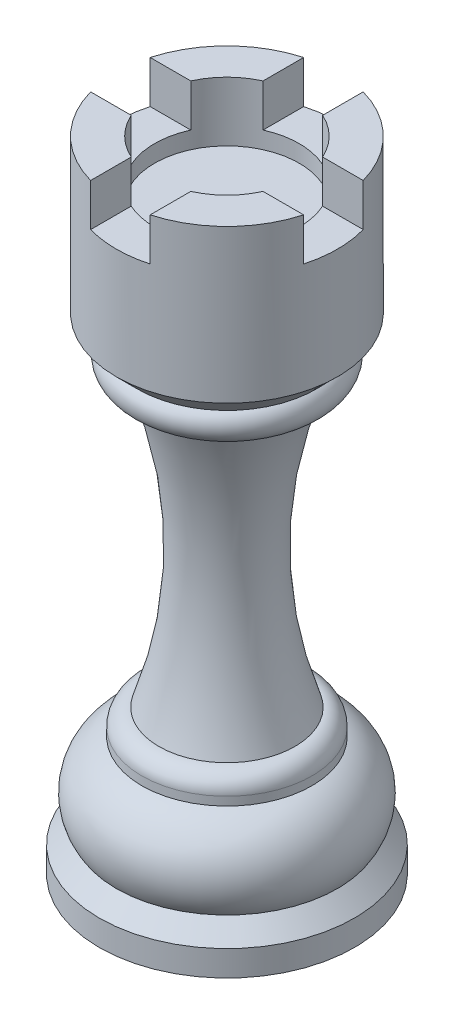
ISO-10303-21;
HEADER;
FILE_DESCRIPTION(('STEP AP214'),'2;1');
FILE_NAME('part.step','',(''),(''),'','','');
FILE_SCHEMA(('AUTOMOTIVE_DESIGN { 1 0 10303 214 1 1 1 1 }'));
ENDSEC;
DATA;
#1=APPLICATION_CONTEXT('core data for automotive mechanical design processes');
#2=APPLICATION_PROTOCOL_DEFINITION('international standard','automotive_design',2000,#1);
#3=PRODUCT_CONTEXT('',#1,'mechanical');
#4=PRODUCT('Part','Part','',(#3));
#5=PRODUCT_RELATED_PRODUCT_CATEGORY('part','',(#4));
#6=PRODUCT_DEFINITION_FORMATION('','',#4);
#7=PRODUCT_DEFINITION_CONTEXT('part definition',#1,'design');
#8=PRODUCT_DEFINITION('design','',#6,#7);
#9=PRODUCT_DEFINITION_SHAPE('','',#8);
#10=(LENGTH_UNIT() NAMED_UNIT(*) SI_UNIT(.MILLI.,.METRE.));
#11=(NAMED_UNIT(*) PLANE_ANGLE_UNIT() SI_UNIT($,.RADIAN.));
#12=(NAMED_UNIT(*) SI_UNIT($,.STERADIAN.) SOLID_ANGLE_UNIT());
#13=UNCERTAINTY_MEASURE_WITH_UNIT(LENGTH_MEASURE(1.E-05),#10,'distance_accuracy_value','');
#14=(GEOMETRIC_REPRESENTATION_CONTEXT(3) GLOBAL_UNCERTAINTY_ASSIGNED_CONTEXT((#13)) GLOBAL_UNIT_ASSIGNED_CONTEXT((#10,
#11,#12)) REPRESENTATION_CONTEXT('',''));
#15=CARTESIAN_POINT('',(0.,0.,0.));
#16=DIRECTION('',(0.,0.,1.));
#17=DIRECTION('',(1.,0.,0.));
#18=AXIS2_PLACEMENT_3D('',#15,#16,#17);
#19=CARTESIAN_POINT('',(0.,75.0939791820636,0.));
#20=DIRECTION('',(0.,1.,0.));
#21=DIRECTION('',(0.,0.,1.));
#22=AXIS2_PLACEMENT_3D('',#19,#20,#21);
#23=CYLINDRICAL_SURFACE('',#22,13.);
#24=CARTESIAN_POINT('',(0.,57.0939791820636,0.));
#25=DIRECTION('',(0.,1.,0.));
#26=DIRECTION('',(0.,0.,1.));
#27=AXIS2_PLACEMENT_3D('',#24,#25,#26);
#28=CIRCLE('',#27,13.);
#29=CARTESIAN_POINT('',(0.,57.0939791820636,13.));
#30=VERTEX_POINT('',#29);
#31=EDGE_CURVE('E311',#30,#30,#28,.T.);
#32=ORIENTED_EDGE('',*,*,#31,.T.);
#33=EDGE_LOOP('',(#32));
#34=FACE_BOUND('',#33,.T.);
#35=CARTESIAN_POINT('',(0.,75.0939791820636,0.));
#36=DIRECTION('',(0.,1.,0.));
#37=DIRECTION('',(0.,0.,1.));
#38=AXIS2_PLACEMENT_3D('',#35,#36,#37);
#39=CIRCLE('',#38,13.);
#40=CARTESIAN_POINT('',(-3.50000000000004,75.0939791820636,-12.5199840255489));
#41=VERTEX_POINT('',#40);
#42=CARTESIAN_POINT('',(-12.5199840255489,75.0939791820636,-3.5));
#43=VERTEX_POINT('',#42);
#44=EDGE_CURVE('E312',#41,#43,#39,.T.);
#45=ORIENTED_EDGE('',*,*,#44,.F.);
#46=DIRECTION('',(0.,1.,0.));
#47=VECTOR('',#46,1.);
#48=CARTESIAN_POINT('',(-3.50000000000004,70.0939791820636,-12.5199840255489));
#49=LINE('',#48,#47);
#50=CARTESIAN_POINT('',(-3.50000000000004,70.0939791820636,-12.5199840255489));
#51=VERTEX_POINT('',#50);
#52=EDGE_CURVE('E186',#51,#41,#49,.T.);
#53=ORIENTED_EDGE('',*,*,#52,.F.);
#54=CARTESIAN_POINT('',(0.,70.0939791820636,0.));
#55=DIRECTION('',(0.,1.,0.));
#56=DIRECTION('',(1.,0.,0.));
#57=AXIS2_PLACEMENT_3D('',#54,#55,#56);
#58=CIRCLE('',#57,13.);
#59=CARTESIAN_POINT('',(3.49999999999996,70.0939791820636,-12.519984025549));
#60=VERTEX_POINT('',#59);
#61=EDGE_CURVE('E167',#60,#51,#58,.T.);
#62=ORIENTED_EDGE('',*,*,#61,.F.);
#63=DIRECTION('',(0.,1.,0.));
#64=VECTOR('',#63,1.);
#65=CARTESIAN_POINT('',(3.49999999999996,70.0939791820636,-12.519984025549));
#66=LINE('',#65,#64);
#67=CARTESIAN_POINT('',(3.49999999999996,75.0939791820636,-12.519984025549));
#68=VERTEX_POINT('',#67);
#69=EDGE_CURVE('E164',#60,#68,#66,.T.);
#70=ORIENTED_EDGE('',*,*,#69,.T.);
#71=CARTESIAN_POINT('',(12.5199840255489,75.0939791820636,-3.5));
#72=VERTEX_POINT('',#71);
#73=EDGE_CURVE('E307',#72,#68,#39,.T.);
#74=ORIENTED_EDGE('',*,*,#73,.F.);
#75=DIRECTION('',(0.,1.,0.));
#76=VECTOR('',#75,1.);
#77=CARTESIAN_POINT('',(12.5199840255489,70.0939791820636,-3.5));
#78=LINE('',#77,#76);
#79=CARTESIAN_POINT('',(12.5199840255489,70.0939791820636,-3.5));
#80=VERTEX_POINT('',#79);
#81=EDGE_CURVE('E285',#80,#72,#78,.T.);
#82=ORIENTED_EDGE('',*,*,#81,.F.);
#83=CARTESIAN_POINT('',(0.,70.0939791820636,0.));
#84=DIRECTION('',(0.,1.,0.));
#85=DIRECTION('',(0.,0.,1.));
#86=AXIS2_PLACEMENT_3D('',#83,#84,#85);
#87=CIRCLE('',#86,13.);
#88=CARTESIAN_POINT('',(12.5199840255489,70.0939791820636,3.5));
#89=VERTEX_POINT('',#88);
#90=EDGE_CURVE('E273',#89,#80,#87,.T.);
#91=ORIENTED_EDGE('',*,*,#90,.F.);
#92=DIRECTION('',(0.,1.,0.));
#93=VECTOR('',#92,1.);
#94=CARTESIAN_POINT('',(12.5199840255489,70.0939791820636,3.5));
#95=LINE('',#94,#93);
#96=CARTESIAN_POINT('',(12.5199840255489,75.0939791820636,3.5));
#97=VERTEX_POINT('',#96);
#98=EDGE_CURVE('E289',#89,#97,#95,.T.);
#99=ORIENTED_EDGE('',*,*,#98,.T.);
#100=CARTESIAN_POINT('',(3.50000000000013,75.0939791820636,12.5199840255489));
#101=VERTEX_POINT('',#100);
#102=EDGE_CURVE('E305',#101,#97,#39,.T.);
#103=ORIENTED_EDGE('',*,*,#102,.F.);
#104=DIRECTION('',(0.,1.,0.));
#105=VECTOR('',#104,1.);
#106=CARTESIAN_POINT('',(3.50000000000013,70.0939791820636,12.5199840255489));
#107=LINE('',#106,#105);
#108=CARTESIAN_POINT('',(3.50000000000013,70.0939791820636,12.5199840255489));
#109=VERTEX_POINT('',#108);
#110=EDGE_CURVE('E209',#109,#101,#107,.T.);
#111=ORIENTED_EDGE('',*,*,#110,.F.);
#112=CARTESIAN_POINT('',(0.,70.0939791820636,0.));
#113=DIRECTION('',(0.,1.,0.));
#114=DIRECTION('',(-1.,0.,0.));
#115=AXIS2_PLACEMENT_3D('',#112,#113,#114);
#116=CIRCLE('',#115,13.);
#117=CARTESIAN_POINT('',(-3.49999999999987,70.0939791820636,12.519984025549));
#118=VERTEX_POINT('',#117);
#119=EDGE_CURVE('E238',#118,#109,#116,.T.);
#120=ORIENTED_EDGE('',*,*,#119,.F.);
#121=DIRECTION('',(0.,1.,0.));
#122=VECTOR('',#121,1.);
#123=CARTESIAN_POINT('',(-3.49999999999987,70.0939791820636,12.519984025549));
#124=LINE('',#123,#122);
#125=CARTESIAN_POINT('',(-3.49999999999987,75.0939791820636,12.519984025549));
#126=VERTEX_POINT('',#125);
#127=EDGE_CURVE('E251',#118,#126,#124,.T.);
#128=ORIENTED_EDGE('',*,*,#127,.T.);
#129=CARTESIAN_POINT('',(-12.5199840255489,75.0939791820636,3.5));
#130=VERTEX_POINT('',#129);
#131=EDGE_CURVE('E644',#130,#126,#39,.T.);
#132=ORIENTED_EDGE('',*,*,#131,.F.);
#133=DIRECTION('',(0.,1.,0.));
#134=VECTOR('',#133,1.);
#135=CARTESIAN_POINT('',(-12.5199840255489,70.0939791820636,3.5));
#136=LINE('',#135,#134);
#137=CARTESIAN_POINT('',(-12.5199840255489,70.0939791820636,3.5));
#138=VERTEX_POINT('',#137);
#139=EDGE_CURVE('E212',#138,#130,#136,.T.);
#140=ORIENTED_EDGE('',*,*,#139,.F.);
#141=CARTESIAN_POINT('',(0.,70.0939791820636,0.));
#142=DIRECTION('',(0.,1.,0.));
#143=DIRECTION('',(0.,0.,-1.));
#144=AXIS2_PLACEMENT_3D('',#141,#142,#143);
#145=CIRCLE('',#144,13.);
#146=CARTESIAN_POINT('',(-12.5199840255489,70.0939791820636,-3.5));
#147=VERTEX_POINT('',#146);
#148=EDGE_CURVE('E201',#147,#138,#145,.T.);
#149=ORIENTED_EDGE('',*,*,#148,.F.);
#150=DIRECTION('',(0.,1.,0.));
#151=VECTOR('',#150,1.);
#152=CARTESIAN_POINT('',(-12.5199840255489,70.0939791820636,-3.5));
#153=LINE('',#152,#151);
#154=EDGE_CURVE('E216',#147,#43,#153,.T.);
#155=ORIENTED_EDGE('',*,*,#154,.T.);
#156=EDGE_LOOP('',(#45,#53,#62,#70,#74,#82,#91,#99,#103,#111,#120,#128,#132,#140,#149,#155));
#157=FACE_BOUND('',#156,.T.);
#158=ADVANCED_FACE('F43',(#34,#157),#23,.T.);
#159=CARTESIAN_POINT('',(-13.,75.0939791820636,0.));
#160=DIRECTION('',(0.,1.,0.));
#161=DIRECTION('',(0.,0.,1.));
#162=AXIS2_PLACEMENT_3D('',#159,#160,#161);
#163=PLANE('',#162);
#164=CARTESIAN_POINT('',(0.,75.0939791820636,0.));
#165=DIRECTION('',(0.,1.,0.));
#166=DIRECTION('',(0.,0.,1.));
#167=AXIS2_PLACEMENT_3D('',#164,#165,#166);
#168=CIRCLE('',#167,8.5);
#169=CARTESIAN_POINT('',(-3.50000000000003,75.0939791820636,-7.74596669241482));
#170=VERTEX_POINT('',#169);
#171=CARTESIAN_POINT('',(-7.74596669241483,75.0939791820636,-3.5));
#172=VERTEX_POINT('',#171);
#173=EDGE_CURVE('E306',#170,#172,#168,.T.);
#174=ORIENTED_EDGE('',*,*,#173,.F.);
#175=DIRECTION('',(0.,0.,-1.));
#176=VECTOR('',#175,1.);
#177=CARTESIAN_POINT('',(-3.5,75.0939791820636,0.));
#178=LINE('',#177,#176);
#179=EDGE_CURVE('E215',#170,#41,#178,.T.);
#180=ORIENTED_EDGE('',*,*,#179,.T.);
#181=ORIENTED_EDGE('',*,*,#44,.T.);
#182=DIRECTION('',(-1.,0.,0.));
#183=VECTOR('',#182,1.);
#184=CARTESIAN_POINT('',(0.,75.0939791820636,-3.5));
#185=LINE('',#184,#183);
#186=EDGE_CURVE('E194',#172,#43,#185,.T.);
#187=ORIENTED_EDGE('',*,*,#186,.F.);
#188=EDGE_LOOP('',(#174,#180,#181,#187));
#189=FACE_BOUND('',#188,.T.);
#190=ADVANCED_FACE('F358',(#189),#163,.T.);
#191=CARTESIAN_POINT('',(-7.74596669241483,75.0939791820636,3.5));
#192=VERTEX_POINT('',#191);
#193=CARTESIAN_POINT('',(-3.49999999999992,75.0939791820636,7.74596669241487));
#194=VERTEX_POINT('',#193);
#195=EDGE_CURVE('E662',#192,#194,#168,.T.);
#196=ORIENTED_EDGE('',*,*,#195,.F.);
#197=DIRECTION('',(-1.,0.,0.));
#198=VECTOR('',#197,1.);
#199=CARTESIAN_POINT('',(0.,75.0939791820636,3.5));
#200=LINE('',#199,#198);
#201=EDGE_CURVE('E205',#192,#130,#200,.T.);
#202=ORIENTED_EDGE('',*,*,#201,.T.);
#203=ORIENTED_EDGE('',*,*,#131,.T.);
#204=DIRECTION('',(0.,0.,1.));
#205=VECTOR('',#204,1.);
#206=CARTESIAN_POINT('',(-3.5,75.0939791820636,0.));
#207=LINE('',#206,#205);
#208=EDGE_CURVE('E230',#194,#126,#207,.T.);
#209=ORIENTED_EDGE('',*,*,#208,.F.);
#210=EDGE_LOOP('',(#196,#202,#203,#209));
#211=FACE_BOUND('',#210,.T.);
#212=ADVANCED_FACE('F364',(#211),#163,.T.);
#213=CARTESIAN_POINT('',(3.50000000000008,75.0939791820636,7.7459666924148));
#214=VERTEX_POINT('',#213);
#215=CARTESIAN_POINT('',(7.74596669241483,75.0939791820636,3.5));
#216=VERTEX_POINT('',#215);
#217=EDGE_CURVE('E302',#214,#216,#168,.T.);
#218=ORIENTED_EDGE('',*,*,#217,.F.);
#219=DIRECTION('',(0.,0.,1.));
#220=VECTOR('',#219,1.);
#221=CARTESIAN_POINT('',(3.5,75.0939791820636,0.));
#222=LINE('',#221,#220);
#223=EDGE_CURVE('E243',#214,#101,#222,.T.);
#224=ORIENTED_EDGE('',*,*,#223,.T.);
#225=ORIENTED_EDGE('',*,*,#102,.T.);
#226=DIRECTION('',(1.,0.,0.));
#227=VECTOR('',#226,1.);
#228=CARTESIAN_POINT('',(0.,75.0939791820636,3.5));
#229=LINE('',#228,#227);
#230=EDGE_CURVE('E265',#216,#97,#229,.T.);
#231=ORIENTED_EDGE('',*,*,#230,.F.);
#232=EDGE_LOOP('',(#218,#224,#225,#231));
#233=FACE_BOUND('',#232,.T.);
#234=ADVANCED_FACE('F564',(#233),#163,.T.);
#235=CARTESIAN_POINT('',(0.,75.0939791820636,0.));
#236=DIRECTION('',(0.,1.,0.));
#237=DIRECTION('',(0.,0.,1.));
#238=AXIS2_PLACEMENT_3D('',#235,#236,#237);
#239=CYLINDRICAL_SURFACE('',#238,8.5);
#240=CARTESIAN_POINT('',(0.,68.0939791820636,0.));
#241=DIRECTION('',(0.,1.,0.));
#242=DIRECTION('',(0.,0.,1.));
#243=AXIS2_PLACEMENT_3D('',#240,#241,#242);
#244=CIRCLE('',#243,8.5);
#245=CARTESIAN_POINT('',(0.,68.0939791820636,8.5));
#246=VERTEX_POINT('',#245);
#247=EDGE_CURVE('E288',#246,#246,#244,.T.);
#248=ORIENTED_EDGE('',*,*,#247,.F.);
#249=EDGE_LOOP('',(#248));
#250=FACE_BOUND('',#249,.T.);
#251=CARTESIAN_POINT('',(0.,70.0939791820636,0.));
#252=DIRECTION('',(0.,1.,0.));
#253=DIRECTION('',(1.,0.,0.));
#254=AXIS2_PLACEMENT_3D('',#251,#252,#253);
#255=CIRCLE('',#254,8.5);
#256=CARTESIAN_POINT('',(-3.50000000000003,70.0939791820636,-7.74596669241482));
#257=VERTEX_POINT('',#256);
#258=CARTESIAN_POINT('',(3.49999999999997,70.0939791820636,-7.74596669241485));
#259=VERTEX_POINT('',#258);
#260=EDGE_CURVE('E168',#257,#259,#255,.F.);
#261=ORIENTED_EDGE('',*,*,#260,.F.);
#262=DIRECTION('',(0.,1.,0.));
#263=VECTOR('',#262,1.);
#264=CARTESIAN_POINT('',(-3.50000000000003,70.0939791820636,-7.74596669241482));
#265=LINE('',#264,#263);
#266=EDGE_CURVE('E182',#257,#170,#265,.T.);
#267=ORIENTED_EDGE('',*,*,#266,.T.);
#268=ORIENTED_EDGE('',*,*,#173,.T.);
#269=DIRECTION('',(0.,1.,0.));
#270=VECTOR('',#269,1.);
#271=CARTESIAN_POINT('',(-7.74596669241483,70.0939791820636,-3.5));
#272=LINE('',#271,#270);
#273=CARTESIAN_POINT('',(-7.74596669241483,70.0939791820636,-3.5));
#274=VERTEX_POINT('',#273);
#275=EDGE_CURVE('E220',#274,#172,#272,.T.);
#276=ORIENTED_EDGE('',*,*,#275,.F.);
#277=CARTESIAN_POINT('',(0.,70.0939791820636,0.));
#278=DIRECTION('',(0.,1.,0.));
#279=DIRECTION('',(0.,0.,-1.));
#280=AXIS2_PLACEMENT_3D('',#277,#278,#279);
#281=CIRCLE('',#280,8.5);
#282=CARTESIAN_POINT('',(-7.74596669241483,70.0939791820636,3.5));
#283=VERTEX_POINT('',#282);
#284=EDGE_CURVE('E193',#283,#274,#281,.F.);
#285=ORIENTED_EDGE('',*,*,#284,.F.);
#286=DIRECTION('',(0.,1.,0.));
#287=VECTOR('',#286,1.);
#288=CARTESIAN_POINT('',(-7.74596669241483,70.0939791820636,3.5));
#289=LINE('',#288,#287);
#290=EDGE_CURVE('E204',#283,#192,#289,.T.);
#291=ORIENTED_EDGE('',*,*,#290,.T.);
#292=ORIENTED_EDGE('',*,*,#195,.T.);
#293=DIRECTION('',(0.,1.,0.));
#294=VECTOR('',#293,1.);
#295=CARTESIAN_POINT('',(-3.49999999999992,70.0939791820636,7.74596669241487));
#296=LINE('',#295,#294);
#297=CARTESIAN_POINT('',(-3.49999999999992,70.0939791820636,7.74596669241487));
#298=VERTEX_POINT('',#297);
#299=EDGE_CURVE('E255',#298,#194,#296,.T.);
#300=ORIENTED_EDGE('',*,*,#299,.F.);
#301=CARTESIAN_POINT('',(0.,70.0939791820636,0.));
#302=DIRECTION('',(0.,1.,0.));
#303=DIRECTION('',(-1.,0.,0.));
#304=AXIS2_PLACEMENT_3D('',#301,#302,#303);
#305=CIRCLE('',#304,8.5);
#306=CARTESIAN_POINT('',(3.50000000000008,70.0939791820636,7.7459666924148));
#307=VERTEX_POINT('',#306);
#308=EDGE_CURVE('E229',#307,#298,#305,.F.);
#309=ORIENTED_EDGE('',*,*,#308,.F.);
#310=DIRECTION('',(0.,1.,0.));
#311=VECTOR('',#310,1.);
#312=CARTESIAN_POINT('',(3.50000000000008,70.0939791820636,7.7459666924148));
#313=LINE('',#312,#311);
#314=EDGE_CURVE('E242',#307,#214,#313,.T.);
#315=ORIENTED_EDGE('',*,*,#314,.T.);
#316=ORIENTED_EDGE('',*,*,#217,.T.);
#317=DIRECTION('',(0.,1.,0.));
#318=VECTOR('',#317,1.);
#319=CARTESIAN_POINT('',(7.74596669241483,70.0939791820636,3.5));
#320=LINE('',#319,#318);
#321=CARTESIAN_POINT('',(7.74596669241483,70.0939791820636,3.5));
#322=VERTEX_POINT('',#321);
#323=EDGE_CURVE('E293',#322,#216,#320,.T.);
#324=ORIENTED_EDGE('',*,*,#323,.F.);
#325=CARTESIAN_POINT('',(0.,70.0939791820636,0.));
#326=DIRECTION('',(0.,1.,0.));
#327=DIRECTION('',(0.,0.,1.));
#328=AXIS2_PLACEMENT_3D('',#325,#326,#327);
#329=CIRCLE('',#328,8.5);
#330=CARTESIAN_POINT('',(7.74596669241483,70.0939791820636,-3.5));
#331=VERTEX_POINT('',#330);
#332=EDGE_CURVE('E264',#331,#322,#329,.F.);
#333=ORIENTED_EDGE('',*,*,#332,.F.);
#334=DIRECTION('',(0.,1.,0.));
#335=VECTOR('',#334,1.);
#336=CARTESIAN_POINT('',(7.74596669241483,70.0939791820636,-3.5));
#337=LINE('',#336,#335);
#338=CARTESIAN_POINT('',(7.74596669241483,75.0939791820636,-3.5));
#339=VERTEX_POINT('',#338);
#340=EDGE_CURVE('E277',#331,#339,#337,.T.);
#341=ORIENTED_EDGE('',*,*,#340,.T.);
#342=CARTESIAN_POINT('',(3.49999999999997,75.0939791820636,-7.74596669241485));
#343=VERTEX_POINT('',#342);
#344=EDGE_CURVE('E180',#339,#343,#168,.T.);
#345=ORIENTED_EDGE('',*,*,#344,.T.);
#346=DIRECTION('',(0.,1.,0.));
#347=VECTOR('',#346,1.);
#348=CARTESIAN_POINT('',(3.49999999999997,70.0939791820636,-7.74596669241485));
#349=LINE('',#348,#347);
#350=EDGE_CURVE('E161',#259,#343,#349,.T.);
#351=ORIENTED_EDGE('',*,*,#350,.F.);
#352=EDGE_LOOP('',(#261,#267,#268,#276,#285,#291,#292,#300,#309,#315,#316,#324,#333,#341,#345,#351));
#353=FACE_BOUND('',#352,.T.);
#354=ADVANCED_FACE('F177',(#250,#353),#239,.F.);
#355=DIRECTION('',(0.,0.,-1.));
#356=VECTOR('',#355,1.);
#357=CARTESIAN_POINT('',(3.5,75.0939791820636,0.));
#358=LINE('',#357,#356);
#359=EDGE_CURVE('E625',#343,#68,#358,.T.);
#360=ORIENTED_EDGE('',*,*,#359,.F.);
#361=ORIENTED_EDGE('',*,*,#344,.F.);
#362=DIRECTION('',(1.,0.,0.));
#363=VECTOR('',#362,1.);
#364=CARTESIAN_POINT('',(0.,75.0939791820636,-3.5));
#365=LINE('',#364,#363);
#366=EDGE_CURVE('E278',#339,#72,#365,.T.);
#367=ORIENTED_EDGE('',*,*,#366,.T.);
#368=ORIENTED_EDGE('',*,*,#73,.T.);
#369=EDGE_LOOP('',(#360,#361,#367,#368));
#370=FACE_BOUND('',#369,.T.);
#371=ADVANCED_FACE('F355',(#370),#163,.T.);
#372=CARTESIAN_POINT('',(0.,0.,0.));
#373=DIRECTION('',(0.,-1.,0.));
#374=DIRECTION('',(0.,0.,-1.));
#375=AXIS2_PLACEMENT_3D('',#372,#373,#374);
#376=PLANE('',#375);
#377=CARTESIAN_POINT('',(0.,0.,0.));
#378=DIRECTION('',(0.,1.,0.));
#379=DIRECTION('',(0.,0.,1.));
#380=AXIS2_PLACEMENT_3D('',#377,#378,#379);
#381=CIRCLE('',#380,15.);
#382=CARTESIAN_POINT('',(0.,0.,15.));
#383=VERTEX_POINT('',#382);
#384=EDGE_CURVE('E11',#383,#383,#381,.T.);
#385=ORIENTED_EDGE('',*,*,#384,.F.);
#386=EDGE_LOOP('',(#385));
#387=FACE_BOUND('',#386,.T.);
#388=ADVANCED_FACE('F45',(#387),#376,.T.);
#389=CARTESIAN_POINT('',(0.,75.0939791820636,0.));
#390=DIRECTION('',(0.,1.,0.));
#391=DIRECTION('',(0.,0.,1.));
#392=AXIS2_PLACEMENT_3D('',#389,#390,#391);
#393=CYLINDRICAL_SURFACE('',#392,15.);
#394=ORIENTED_EDGE('',*,*,#384,.T.);
#395=EDGE_LOOP('',(#394));
#396=FACE_BOUND('',#395,.T.);
#397=CARTESIAN_POINT('',(0.,3.,0.));
#398=DIRECTION('',(0.,1.,0.));
#399=DIRECTION('',(0.,0.,1.));
#400=AXIS2_PLACEMENT_3D('',#397,#398,#399);
#401=CIRCLE('',#400,15.);
#402=CARTESIAN_POINT('',(0.,3.,15.));
#403=VERTEX_POINT('',#402);
#404=EDGE_CURVE('E52',#403,#403,#401,.T.);
#405=ORIENTED_EDGE('',*,*,#404,.F.);
#406=EDGE_LOOP('',(#405));
#407=FACE_BOUND('',#406,.T.);
#408=ADVANCED_FACE('F346',(#396,#407),#393,.T.);
#409=CARTESIAN_POINT('',(0.,5.,0.));
#410=DIRECTION('',(0.,-1.,0.));
#411=DIRECTION('',(0.,0.,-1.));
#412=AXIS2_PLACEMENT_3D('',#409,#410,#411);
#413=CONICAL_SURFACE('',#412,13.,0.785398163397447);
#414=ORIENTED_EDGE('',*,*,#404,.T.);
#415=EDGE_LOOP('',(#414));
#416=FACE_BOUND('',#415,.T.);
#417=CARTESIAN_POINT('',(0.,5.,0.));
#418=DIRECTION('',(0.,1.,0.));
#419=DIRECTION('',(0.,0.,1.));
#420=AXIS2_PLACEMENT_3D('',#417,#418,#419);
#421=CIRCLE('',#420,13.);
#422=CARTESIAN_POINT('',(0.,5.,13.));
#423=VERTEX_POINT('',#422);
#424=EDGE_CURVE('E336',#423,#423,#421,.T.);
#425=ORIENTED_EDGE('',*,*,#424,.F.);
#426=EDGE_LOOP('',(#425));
#427=FACE_BOUND('',#426,.T.);
#428=ADVANCED_FACE('F343',(#416,#427),#413,.T.);
#429=CARTESIAN_POINT('',(0.,8.31380661428568,0.));
#430=DIRECTION('',(0.,1.,0.));
#431=DIRECTION('',(0.,0.,1.));
#432=AXIS2_PLACEMENT_3D('',#429,#430,#431);
#433=TOROIDAL_SURFACE('',#432,7.99813177671418,6.);
#434=ORIENTED_EDGE('',*,*,#424,.T.);
#435=EDGE_LOOP('',(#434));
#436=FACE_BOUND('',#435,.T.);
#437=CARTESIAN_POINT('',(0.,13.97,0.));
#438=DIRECTION('',(0.,1.,0.));
#439=DIRECTION('',(0.,0.,1.));
#440=AXIS2_PLACEMENT_3D('',#437,#438,#439);
#441=CIRCLE('',#440,10.);
#442=CARTESIAN_POINT('',(0.,13.97,10.));
#443=VERTEX_POINT('',#442);
#444=EDGE_CURVE('E332',#443,#443,#441,.T.);
#445=ORIENTED_EDGE('',*,*,#444,.F.);
#446=EDGE_LOOP('',(#445));
#447=FACE_BOUND('',#446,.T.);
#448=ADVANCED_FACE('F353',(#436,#447),#433,.T.);
#449=CARTESIAN_POINT('',(0.,75.0939791820636,0.));
#450=DIRECTION('',(0.,1.,0.));
#451=DIRECTION('',(0.,0.,1.));
#452=AXIS2_PLACEMENT_3D('',#449,#450,#451);
#453=CYLINDRICAL_SURFACE('',#452,10.);
#454=ORIENTED_EDGE('',*,*,#444,.T.);
#455=EDGE_LOOP('',(#454));
#456=FACE_BOUND('',#455,.T.);
#457=CARTESIAN_POINT('',(0.,14.97,0.));
#458=DIRECTION('',(0.,1.,0.));
#459=DIRECTION('',(0.,0.,1.));
#460=AXIS2_PLACEMENT_3D('',#457,#458,#459);
#461=CIRCLE('',#460,10.);
#462=CARTESIAN_POINT('',(0.,14.97,10.));
#463=VERTEX_POINT('',#462);
#464=EDGE_CURVE('E328',#463,#463,#461,.T.);
#465=ORIENTED_EDGE('',*,*,#464,.F.);
#466=EDGE_LOOP('',(#465));
#467=FACE_BOUND('',#466,.T.);
#468=ADVANCED_FACE('F386',(#456,#467),#453,.T.);
#469=CARTESIAN_POINT('',(0.,14.97,0.));
#470=DIRECTION('',(0.,1.,0.));
#471=DIRECTION('',(0.,0.,1.));
#472=AXIS2_PLACEMENT_3D('',#469,#470,#471);
#473=TOROIDAL_SURFACE('',#472,8.,2.);
#474=ORIENTED_EDGE('',*,*,#464,.T.);
#475=EDGE_LOOP('',(#474));
#476=FACE_BOUND('',#475,.T.);
#477=CARTESIAN_POINT('',(0.,16.97,0.));
#478=DIRECTION('',(0.,1.,0.));
#479=DIRECTION('',(0.,0.,1.));
#480=AXIS2_PLACEMENT_3D('',#477,#478,#479);
#481=CIRCLE('',#480,8.);
#482=CARTESIAN_POINT('',(0.,16.97,8.));
#483=VERTEX_POINT('',#482);
#484=EDGE_CURVE('E324',#483,#483,#481,.T.);
#485=ORIENTED_EDGE('',*,*,#484,.F.);
#486=EDGE_LOOP('',(#485));
#487=FACE_BOUND('',#486,.T.);
#488=ADVANCED_FACE('F382',(#476,#487),#473,.T.);
#489=CARTESIAN_POINT('',(0.,33.3831679523225,0.));
#490=DIRECTION('',(0.,1.,0.));
#491=DIRECTION('',(0.,0.,1.));
#492=AXIS2_PLACEMENT_3D('',#489,#490,#491);
#493=TOROIDAL_SURFACE('',#492,55.2293120611433,50.);
#494=ORIENTED_EDGE('',*,*,#484,.T.);
#495=EDGE_LOOP('',(#494));
#496=FACE_BOUND('',#495,.T.);
#497=CARTESIAN_POINT('',(0.,51.17,0.));
#498=DIRECTION('',(0.,1.,0.));
#499=DIRECTION('',(0.,0.,1.));
#500=AXIS2_PLACEMENT_3D('',#497,#498,#499);
#501=CIRCLE('',#500,8.50000000000001);
#502=CARTESIAN_POINT('',(0.,51.17,8.50000000000001));
#503=VERTEX_POINT('',#502);
#504=EDGE_CURVE('E320',#503,#503,#501,.T.);
#505=ORIENTED_EDGE('',*,*,#504,.F.);
#506=EDGE_LOOP('',(#505));
#507=FACE_BOUND('',#506,.T.);
#508=ADVANCED_FACE('F378',(#496,#507),#493,.F.);
#509=CARTESIAN_POINT('',(0.,53.0145660123232,0.));
#510=DIRECTION('',(0.,1.,0.));
#511=DIRECTION('',(0.,0.,1.));
#512=AXIS2_PLACEMENT_3D('',#509,#510,#511);
#513=TOROIDAL_SURFACE('',#512,9.27303054673294,1.99999999999999);
#514=ORIENTED_EDGE('',*,*,#504,.T.);
#515=EDGE_LOOP('',(#514));
#516=FACE_BOUND('',#515,.T.);
#517=CARTESIAN_POINT('',(0.,54.5939791820636,0.));
#518=DIRECTION('',(0.,1.,0.));
#519=DIRECTION('',(0.,0.,1.));
#520=AXIS2_PLACEMENT_3D('',#517,#518,#519);
#521=CIRCLE('',#520,10.5);
#522=CARTESIAN_POINT('',(0.,54.5939791820636,10.5));
#523=VERTEX_POINT('',#522);
#524=EDGE_CURVE('E316',#523,#523,#521,.T.);
#525=ORIENTED_EDGE('',*,*,#524,.F.);
#526=EDGE_LOOP('',(#525));
#527=FACE_BOUND('',#526,.T.);
#528=ADVANCED_FACE('F374',(#516,#527),#513,.T.);
#529=CARTESIAN_POINT('',(0.,57.0939791820636,0.));
#530=DIRECTION('',(0.,1.,0.));
#531=DIRECTION('',(0.,0.,1.));
#532=AXIS2_PLACEMENT_3D('',#529,#530,#531);
#533=CONICAL_SURFACE('',#532,13.,0.78539816339745);
#534=ORIENTED_EDGE('',*,*,#524,.T.);
#535=EDGE_LOOP('',(#534));
#536=FACE_BOUND('',#535,.T.);
#537=ORIENTED_EDGE('',*,*,#31,.F.);
#538=EDGE_LOOP('',(#537));
#539=FACE_BOUND('',#538,.T.);
#540=ADVANCED_FACE('F370',(#536,#539),#533,.T.);
#541=CARTESIAN_POINT('',(-8.5,68.0939791820636,0.));
#542=DIRECTION('',(0.,1.,0.));
#543=DIRECTION('',(0.,0.,1.));
#544=AXIS2_PLACEMENT_3D('',#541,#542,#543);
#545=PLANE('',#544);
#546=ORIENTED_EDGE('',*,*,#247,.T.);
#547=EDGE_LOOP('',(#546));
#548=FACE_BOUND('',#547,.T.);
#549=ADVANCED_FACE('F373',(#548),#545,.T.);
#550=CARTESIAN_POINT('',(0.,70.0939791820636,-3.5));
#551=DIRECTION('',(0.,0.,1.));
#552=DIRECTION('',(1.,0.,0.));
#553=AXIS2_PLACEMENT_3D('',#550,#551,#552);
#554=PLANE('',#553);
#555=ORIENTED_EDGE('',*,*,#366,.F.);
#556=ORIENTED_EDGE('',*,*,#340,.F.);
#557=DIRECTION('',(1.,0.,0.));
#558=VECTOR('',#557,1.);
#559=CARTESIAN_POINT('',(0.,70.0939791820636,-3.5));
#560=LINE('',#559,#558);
#561=EDGE_CURVE('E261',#331,#80,#560,.T.);
#562=ORIENTED_EDGE('',*,*,#561,.T.);
#563=ORIENTED_EDGE('',*,*,#81,.T.);
#564=EDGE_LOOP('',(#555,#556,#562,#563));
#565=FACE_BOUND('',#564,.T.);
#566=ADVANCED_FACE('F436',(#565),#554,.T.);
#567=CARTESIAN_POINT('',(0.,70.0939791820636,3.5));
#568=DIRECTION('',(0.,0.,1.));
#569=DIRECTION('',(1.,0.,0.));
#570=AXIS2_PLACEMENT_3D('',#567,#568,#569);
#571=PLANE('',#570);
#572=ORIENTED_EDGE('',*,*,#230,.T.);
#573=ORIENTED_EDGE('',*,*,#98,.F.);
#574=DIRECTION('',(1.,0.,0.));
#575=VECTOR('',#574,1.);
#576=CARTESIAN_POINT('',(0.,70.0939791820636,3.5));
#577=LINE('',#576,#575);
#578=EDGE_CURVE('E269',#322,#89,#577,.T.);
#579=ORIENTED_EDGE('',*,*,#578,.F.);
#580=ORIENTED_EDGE('',*,*,#323,.T.);
#581=EDGE_LOOP('',(#572,#573,#579,#580));
#582=FACE_BOUND('',#581,.T.);
#583=ADVANCED_FACE('F444',(#582),#571,.F.);
#584=CARTESIAN_POINT('',(0.,70.0939791820636,0.));
#585=DIRECTION('',(0.,1.,0.));
#586=DIRECTION('',(0.,0.,1.));
#587=AXIS2_PLACEMENT_3D('',#584,#585,#586);
#588=PLANE('',#587);
#589=ORIENTED_EDGE('',*,*,#561,.F.);
#590=ORIENTED_EDGE('',*,*,#332,.T.);
#591=ORIENTED_EDGE('',*,*,#578,.T.);
#592=ORIENTED_EDGE('',*,*,#90,.T.);
#593=EDGE_LOOP('',(#589,#590,#591,#592));
#594=FACE_BOUND('',#593,.T.);
#595=ADVANCED_FACE('F452',(#594),#588,.T.);
#596=CARTESIAN_POINT('',(3.5,70.0939791820636,0.));
#597=DIRECTION('',(-1.,0.,0.));
#598=DIRECTION('',(0.,0.,1.));
#599=AXIS2_PLACEMENT_3D('',#596,#597,#598);
#600=PLANE('',#599);
#601=ORIENTED_EDGE('',*,*,#223,.F.);
#602=ORIENTED_EDGE('',*,*,#314,.F.);
#603=DIRECTION('',(0.,0.,1.));
#604=VECTOR('',#603,1.);
#605=CARTESIAN_POINT('',(3.5,70.0939791820636,0.));
#606=LINE('',#605,#604);
#607=EDGE_CURVE('E226',#307,#109,#606,.T.);
#608=ORIENTED_EDGE('',*,*,#607,.T.);
#609=ORIENTED_EDGE('',*,*,#110,.T.);
#610=EDGE_LOOP('',(#601,#602,#608,#609));
#611=FACE_BOUND('',#610,.T.);
#612=ADVANCED_FACE('F460',(#611),#600,.T.);
#613=CARTESIAN_POINT('',(-3.5,70.0939791820636,0.));
#614=DIRECTION('',(-1.,0.,0.));
#615=DIRECTION('',(0.,0.,1.));
#616=AXIS2_PLACEMENT_3D('',#613,#614,#615);
#617=PLANE('',#616);
#618=ORIENTED_EDGE('',*,*,#208,.T.);
#619=ORIENTED_EDGE('',*,*,#127,.F.);
#620=DIRECTION('',(0.,0.,1.));
#621=VECTOR('',#620,1.);
#622=CARTESIAN_POINT('',(-3.5,70.0939791820636,0.));
#623=LINE('',#622,#621);
#624=EDGE_CURVE('E234',#298,#118,#623,.T.);
#625=ORIENTED_EDGE('',*,*,#624,.F.);
#626=ORIENTED_EDGE('',*,*,#299,.T.);
#627=EDGE_LOOP('',(#618,#619,#625,#626));
#628=FACE_BOUND('',#627,.T.);
#629=ADVANCED_FACE('F468',(#628),#617,.F.);
#630=CARTESIAN_POINT('',(0.,70.0939791820636,0.));
#631=DIRECTION('',(0.,1.,0.));
#632=DIRECTION('',(-1.,0.,0.));
#633=AXIS2_PLACEMENT_3D('',#630,#631,#632);
#634=PLANE('',#633);
#635=ORIENTED_EDGE('',*,*,#607,.F.);
#636=ORIENTED_EDGE('',*,*,#308,.T.);
#637=ORIENTED_EDGE('',*,*,#624,.T.);
#638=ORIENTED_EDGE('',*,*,#119,.T.);
#639=EDGE_LOOP('',(#635,#636,#637,#638));
#640=FACE_BOUND('',#639,.T.);
#641=ADVANCED_FACE('F477',(#640),#634,.T.);
#642=CARTESIAN_POINT('',(0.,70.0939791820636,3.5));
#643=DIRECTION('',(0.,0.,-1.));
#644=DIRECTION('',(-1.,0.,0.));
#645=AXIS2_PLACEMENT_3D('',#642,#643,#644);
#646=PLANE('',#645);
#647=ORIENTED_EDGE('',*,*,#201,.F.);
#648=ORIENTED_EDGE('',*,*,#290,.F.);
#649=DIRECTION('',(-1.,0.,0.));
#650=VECTOR('',#649,1.);
#651=CARTESIAN_POINT('',(0.,70.0939791820636,3.5));
#652=LINE('',#651,#650);
#653=EDGE_CURVE('E67',#283,#138,#652,.T.);
#654=ORIENTED_EDGE('',*,*,#653,.T.);
#655=ORIENTED_EDGE('',*,*,#139,.T.);
#656=EDGE_LOOP('',(#647,#648,#654,#655));
#657=FACE_BOUND('',#656,.T.);
#658=ADVANCED_FACE('F485',(#657),#646,.T.);
#659=CARTESIAN_POINT('',(0.,70.0939791820636,-3.5));
#660=DIRECTION('',(0.,0.,-1.));
#661=DIRECTION('',(-1.,0.,0.));
#662=AXIS2_PLACEMENT_3D('',#659,#660,#661);
#663=PLANE('',#662);
#664=ORIENTED_EDGE('',*,*,#186,.T.);
#665=ORIENTED_EDGE('',*,*,#154,.F.);
#666=DIRECTION('',(-1.,0.,0.));
#667=VECTOR('',#666,1.);
#668=CARTESIAN_POINT('',(0.,70.0939791820636,-3.5));
#669=LINE('',#668,#667);
#670=EDGE_CURVE('E197',#274,#147,#669,.T.);
#671=ORIENTED_EDGE('',*,*,#670,.F.);
#672=ORIENTED_EDGE('',*,*,#275,.T.);
#673=EDGE_LOOP('',(#664,#665,#671,#672));
#674=FACE_BOUND('',#673,.T.);
#675=ADVANCED_FACE('F493',(#674),#663,.F.);
#676=CARTESIAN_POINT('',(0.,70.0939791820636,0.));
#677=DIRECTION('',(0.,1.,0.));
#678=DIRECTION('',(0.,0.,-1.));
#679=AXIS2_PLACEMENT_3D('',#676,#677,#678);
#680=PLANE('',#679);
#681=ORIENTED_EDGE('',*,*,#653,.F.);
#682=ORIENTED_EDGE('',*,*,#284,.T.);
#683=ORIENTED_EDGE('',*,*,#670,.T.);
#684=ORIENTED_EDGE('',*,*,#148,.T.);
#685=EDGE_LOOP('',(#681,#682,#683,#684));
#686=FACE_BOUND('',#685,.T.);
#687=ADVANCED_FACE('F501',(#686),#680,.T.);
#688=CARTESIAN_POINT('',(-3.5,70.0939791820636,0.));
#689=DIRECTION('',(1.,0.,0.));
#690=DIRECTION('',(0.,0.,-1.));
#691=AXIS2_PLACEMENT_3D('',#688,#689,#690);
#692=PLANE('',#691);
#693=ORIENTED_EDGE('',*,*,#179,.F.);
#694=ORIENTED_EDGE('',*,*,#266,.F.);
#695=DIRECTION('',(0.,0.,-1.));
#696=VECTOR('',#695,1.);
#697=CARTESIAN_POINT('',(-3.5,70.0939791820636,0.));
#698=LINE('',#697,#696);
#699=EDGE_CURVE('E59',#257,#51,#698,.T.);
#700=ORIENTED_EDGE('',*,*,#699,.T.);
#701=ORIENTED_EDGE('',*,*,#52,.T.);
#702=EDGE_LOOP('',(#693,#694,#700,#701));
#703=FACE_BOUND('',#702,.T.);
#704=ADVANCED_FACE('F509',(#703),#692,.T.);
#705=CARTESIAN_POINT('',(3.5,70.0939791820636,0.));
#706=DIRECTION('',(1.,0.,0.));
#707=DIRECTION('',(0.,0.,-1.));
#708=AXIS2_PLACEMENT_3D('',#705,#706,#707);
#709=PLANE('',#708);
#710=ORIENTED_EDGE('',*,*,#359,.T.);
#711=ORIENTED_EDGE('',*,*,#69,.F.);
#712=DIRECTION('',(0.,0.,-1.));
#713=VECTOR('',#712,1.);
#714=CARTESIAN_POINT('',(3.5,70.0939791820636,0.));
#715=LINE('',#714,#713);
#716=EDGE_CURVE('E158',#259,#60,#715,.T.);
#717=ORIENTED_EDGE('',*,*,#716,.F.);
#718=ORIENTED_EDGE('',*,*,#350,.T.);
#719=EDGE_LOOP('',(#710,#711,#717,#718));
#720=FACE_BOUND('',#719,.T.);
#721=ADVANCED_FACE('F159',(#720),#709,.F.);
#722=CARTESIAN_POINT('',(0.,70.0939791820636,0.));
#723=DIRECTION('',(0.,1.,0.));
#724=DIRECTION('',(1.,0.,0.));
#725=AXIS2_PLACEMENT_3D('',#722,#723,#724);
#726=PLANE('',#725);
#727=ORIENTED_EDGE('',*,*,#699,.F.);
#728=ORIENTED_EDGE('',*,*,#260,.T.);
#729=ORIENTED_EDGE('',*,*,#716,.T.);
#730=ORIENTED_EDGE('',*,*,#61,.T.);
#731=EDGE_LOOP('',(#727,#728,#729,#730));
#732=FACE_BOUND('',#731,.T.);
#733=ADVANCED_FACE('F171',(#732),#726,.T.);
#734=CLOSED_SHELL('',(#158,#190,#212,#234,#354,#371,#388,#408,#428,#448,#468,#488,#508,#528,
#540,#549,#566,#583,#595,#612,#629,#641,#658,#675,#687,#704,#721,#733));
#735=MANIFOLD_SOLID_BREP('B2',#734);
#736=ADVANCED_BREP_SHAPE_REPRESENTATION('',(#18,#735),#14);
#737=SHAPE_DEFINITION_REPRESENTATION(#9,#736);
ENDSEC;
END-ISO-10303-21;
